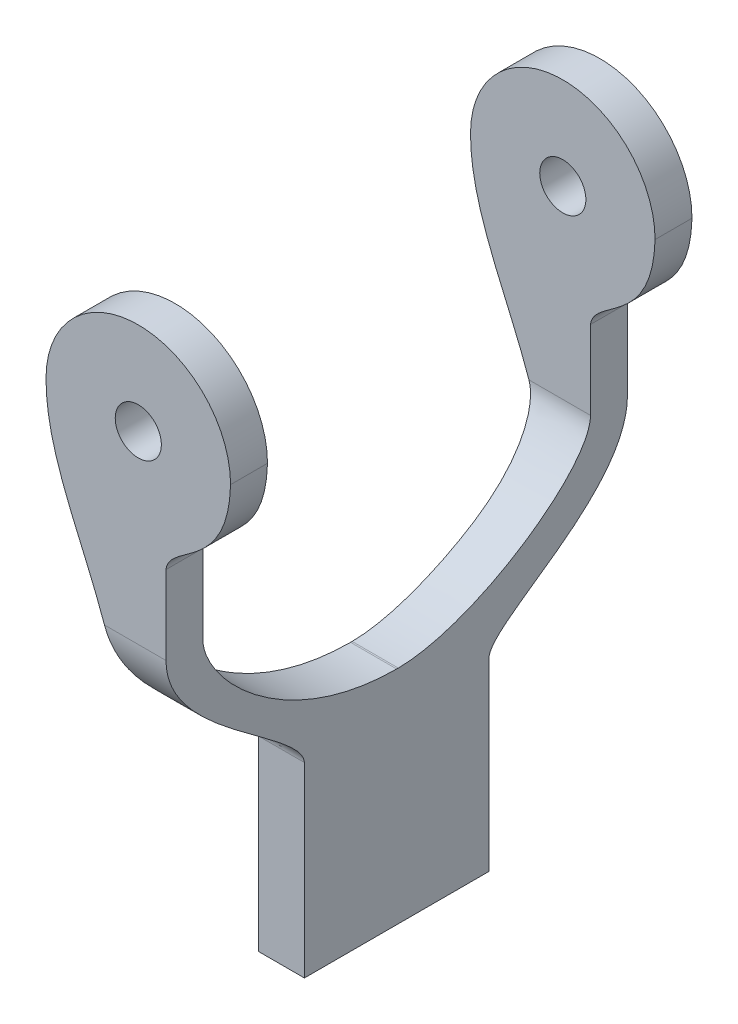
ISO-10303-21;
HEADER;
FILE_DESCRIPTION(('STEP AP214'),'2;1');
FILE_NAME('part.step','',(''),(''),'','','');
FILE_SCHEMA(('AUTOMOTIVE_DESIGN { 1 0 10303 214 1 1 1 1 }'));
ENDSEC;
DATA;
#1=APPLICATION_CONTEXT('core data for automotive mechanical design processes');
#2=APPLICATION_PROTOCOL_DEFINITION('international standard','automotive_design',2000,#1);
#3=PRODUCT_CONTEXT('',#1,'mechanical');
#4=PRODUCT('Part','Part','',(#3));
#5=PRODUCT_RELATED_PRODUCT_CATEGORY('part','',(#4));
#6=PRODUCT_DEFINITION_FORMATION('','',#4);
#7=PRODUCT_DEFINITION_CONTEXT('part definition',#1,'design');
#8=PRODUCT_DEFINITION('design','',#6,#7);
#9=PRODUCT_DEFINITION_SHAPE('','',#8);
#10=(LENGTH_UNIT() NAMED_UNIT(*) SI_UNIT(.MILLI.,.METRE.));
#11=(NAMED_UNIT(*) PLANE_ANGLE_UNIT() SI_UNIT($,.RADIAN.));
#12=(NAMED_UNIT(*) SI_UNIT($,.STERADIAN.) SOLID_ANGLE_UNIT());
#13=UNCERTAINTY_MEASURE_WITH_UNIT(LENGTH_MEASURE(1.E-05),#10,'distance_accuracy_value','');
#14=(GEOMETRIC_REPRESENTATION_CONTEXT(3) GLOBAL_UNCERTAINTY_ASSIGNED_CONTEXT((#13)) GLOBAL_UNIT_ASSIGNED_CONTEXT((#10,
#11,#12)) REPRESENTATION_CONTEXT('',''));
#15=CARTESIAN_POINT('',(0.,0.,0.));
#16=DIRECTION('',(0.,0.,1.));
#17=DIRECTION('',(1.,0.,0.));
#18=AXIS2_PLACEMENT_3D('',#15,#16,#17);
#19=CARTESIAN_POINT('',(3.,0.,25.));
#20=DIRECTION('',(1.,0.,0.));
#21=DIRECTION('',(0.,0.,-1.));
#22=AXIS2_PLACEMENT_3D('',#19,#20,#21);
#23=PLANE('',#22);
#24=DIRECTION('',(0.,1.,0.));
#25=VECTOR('',#24,1.);
#26=CARTESIAN_POINT('',(3.,0.,-10.));
#27=LINE('',#26,#25);
#28=CARTESIAN_POINT('',(3.,-57.3,-10.));
#29=VERTEX_POINT('',#28);
#30=CARTESIAN_POINT('',(3.,-37.3,-10.));
#31=VERTEX_POINT('',#30);
#32=EDGE_CURVE('E347',#29,#31,#27,.T.);
#33=ORIENTED_EDGE('',*,*,#32,.T.);
#34=CARTESIAN_POINT('',(3.,-37.3,-9.99999999999999));
#35=CARTESIAN_POINT('',(3.,-34.0652013670459,-10.0479767693539));
#36=CARTESIAN_POINT('',(3.,-28.7930723376255,-25.1781601039604));
#37=CARTESIAN_POINT('',(3.,-20.0028165207012,-25.));
#38=B_SPLINE_CURVE_WITH_KNOTS('',3,(#34,#35,#36,#37),.UNSPECIFIED.,.F.,.F.,(4,4),(0.,1.),.UNSPECIFIED.);
#39=CARTESIAN_POINT('',(3.,-20.3106734036544,-25.));
#40=VERTEX_POINT('',#39);
#41=EDGE_CURVE('E459',#31,#40,#38,.T.);
#42=ORIENTED_EDGE('',*,*,#41,.T.);
#43=DIRECTION('',(0.,-1.,0.));
#44=VECTOR('',#43,1.);
#45=CARTESIAN_POINT('',(3.,0.,-25.));
#46=LINE('',#45,#44);
#47=CARTESIAN_POINT('',(3.,-11.4728165207012,-25.));
#48=VERTEX_POINT('',#47);
#49=EDGE_CURVE('E493',#48,#40,#46,.T.);
#50=ORIENTED_EDGE('',*,*,#49,.F.);
#51=DIRECTION('',(0.,0.,-1.));
#52=VECTOR('',#51,1.);
#53=CARTESIAN_POINT('',(3.,-11.4728165207012,25.));
#54=LINE('',#53,#52);
#55=CARTESIAN_POINT('',(3.,-11.4728165207012,-21.));
#56=VERTEX_POINT('',#55);
#57=EDGE_CURVE('E385',#56,#48,#54,.T.);
#58=ORIENTED_EDGE('',*,*,#57,.F.);
#59=DIRECTION('',(0.,1.,0.));
#60=VECTOR('',#59,1.);
#61=CARTESIAN_POINT('',(3.,0.,-21.));
#62=LINE('',#61,#60);
#63=CARTESIAN_POINT('',(3.,-20.0028165207012,-21.));
#64=VERTEX_POINT('',#63);
#65=EDGE_CURVE('E402',#64,#56,#62,.T.);
#66=ORIENTED_EDGE('',*,*,#65,.F.);
#67=CARTESIAN_POINT('',(3.,-33.3,0.));
#68=CARTESIAN_POINT('',(3.,-33.359111525618,-8.33744702188347));
#69=CARTESIAN_POINT('',(3.,-24.8668680805232,-20.9939397330463));
#70=CARTESIAN_POINT('',(3.,-20.,-21.));
#71=B_SPLINE_CURVE_WITH_KNOTS('',3,(#67,#68,#69,#70),.UNSPECIFIED.,.F.,.F.,(4,4),(0.,1.),.UNSPECIFIED.);
#72=CARTESIAN_POINT('',(3.,-33.3,-0.174087166710104));
#73=VERTEX_POINT('',#72);
#74=EDGE_CURVE('E497',#73,#64,#71,.T.);
#75=ORIENTED_EDGE('',*,*,#74,.F.);
#76=DIRECTION('',(0.,0.,-1.));
#77=VECTOR('',#76,1.);
#78=CARTESIAN_POINT('',(3.,-33.3,25.));
#79=LINE('',#78,#77);
#80=CARTESIAN_POINT('',(3.,-33.3,0.));
#81=VERTEX_POINT('',#80);
#82=EDGE_CURVE('E418',#81,#73,#79,.T.);
#83=ORIENTED_EDGE('',*,*,#82,.F.);
#84=CARTESIAN_POINT('',(3.,-33.3,0.));
#85=CARTESIAN_POINT('',(3.,-33.2659898949271,12.3142037143707));
#86=CARTESIAN_POINT('',(3.,-24.1587315010529,21.0250877018744));
#87=CARTESIAN_POINT('',(3.,-20.,21.));
#88=B_SPLINE_CURVE_WITH_KNOTS('',3,(#84,#85,#86,#87),.UNSPECIFIED.,.F.,.F.,(4,4),(0.,1.),.UNSPECIFIED.);
#89=CARTESIAN_POINT('',(3.,-20.0359703307455,21.));
#90=VERTEX_POINT('',#89);
#91=EDGE_CURVE('E560',#81,#90,#88,.T.);
#92=ORIENTED_EDGE('',*,*,#91,.T.);
#93=DIRECTION('',(0.,1.,0.));
#94=VECTOR('',#93,1.);
#95=CARTESIAN_POINT('',(3.,0.,21.));
#96=LINE('',#95,#94);
#97=CARTESIAN_POINT('',(3.,-11.4728165207012,21.));
#98=VERTEX_POINT('',#97);
#99=EDGE_CURVE('E602',#90,#98,#96,.T.);
#100=ORIENTED_EDGE('',*,*,#99,.T.);
#101=CARTESIAN_POINT('',(3.,-11.4728165207012,25.));
#102=VERTEX_POINT('',#101);
#103=EDGE_CURVE('E386',#102,#98,#54,.T.);
#104=ORIENTED_EDGE('',*,*,#103,.F.);
#105=DIRECTION('',(0.,-1.,0.));
#106=VECTOR('',#105,1.);
#107=CARTESIAN_POINT('',(3.,0.,25.));
#108=LINE('',#107,#106);
#109=CARTESIAN_POINT('',(3.,-20.0028165207012,25.));
#110=VERTEX_POINT('',#109);
#111=EDGE_CURVE('E517',#102,#110,#108,.T.);
#112=ORIENTED_EDGE('',*,*,#111,.T.);
#113=CARTESIAN_POINT('',(3.,-20.0028165207012,25.));
#114=CARTESIAN_POINT('',(3.,-27.9711739392225,24.9582128322427));
#115=CARTESIAN_POINT('',(3.,-33.8732366485427,9.68018084542401));
#116=CARTESIAN_POINT('',(3.,-37.3,10.));
#117=B_SPLINE_CURVE_WITH_KNOTS('',3,(#113,#114,#115,#116),.UNSPECIFIED.,.F.,.F.,(4,4),(0.,1.),.UNSPECIFIED.);
#118=CARTESIAN_POINT('',(3.,-37.083079187129,10.));
#119=VERTEX_POINT('',#118);
#120=EDGE_CURVE('E238',#110,#119,#117,.T.);
#121=ORIENTED_EDGE('',*,*,#120,.T.);
#122=DIRECTION('',(0.,1.,0.));
#123=VECTOR('',#122,1.);
#124=CARTESIAN_POINT('',(3.,0.,10.));
#125=LINE('',#124,#123);
#126=CARTESIAN_POINT('',(3.,-57.3,10.));
#127=VERTEX_POINT('',#126);
#128=EDGE_CURVE('E363',#127,#119,#125,.T.);
#129=ORIENTED_EDGE('',*,*,#128,.F.);
#130=DIRECTION('',(0.,0.,-1.));
#131=VECTOR('',#130,1.);
#132=CARTESIAN_POINT('',(3.,-57.3,25.));
#133=LINE('',#132,#131);
#134=EDGE_CURVE('E369',#127,#29,#133,.T.);
#135=ORIENTED_EDGE('',*,*,#134,.T.);
#136=EDGE_LOOP('',(#33,#42,#50,#58,#66,#75,#83,#92,#100,#104,#112,#121,#129,#135));
#137=FACE_BOUND('',#136,.T.);
#138=ADVANCED_FACE('F214',(#137),#23,.T.);
#139=CARTESIAN_POINT('',(10.,0.,25.));
#140=CARTESIAN_POINT('',(9.76053706222571,-8.68136411070865,25.));
#141=CARTESIAN_POINT('',(3.33669046636107,-8.62356863497837,25.));
#142=CARTESIAN_POINT('',(3.,-11.4728165207012,25.));
#143=B_SPLINE_CURVE_WITH_KNOTS('',3,(#139,#140,#141,#142),.UNSPECIFIED.,.F.,.F.,(4,4),(0.,1.),.UNSPECIFIED.);
#144=DIRECTION('',(0.,0.,-1.));
#145=VECTOR('',#144,1.);
#146=SURFACE_OF_LINEAR_EXTRUSION('',#143,#145);
#147=ORIENTED_EDGE('',*,*,#103,.T.);
#148=CARTESIAN_POINT('',(10.,0.,21.));
#149=CARTESIAN_POINT('',(9.76053706222571,-8.68136411070865,21.));
#150=CARTESIAN_POINT('',(3.33669046636107,-8.62356863497837,21.));
#151=CARTESIAN_POINT('',(3.,-11.4728165207012,21.));
#152=B_SPLINE_CURVE_WITH_KNOTS('',3,(#148,#149,#150,#151),.UNSPECIFIED.,.F.,.F.,(4,4),(0.,1.),.UNSPECIFIED.);
#153=CARTESIAN_POINT('',(10.,0.,21.));
#154=VERTEX_POINT('',#153);
#155=EDGE_CURVE('E614',#98,#154,#152,.F.);
#156=ORIENTED_EDGE('',*,*,#155,.T.);
#157=DIRECTION('',(0.,0.,-1.));
#158=VECTOR('',#157,1.);
#159=CARTESIAN_POINT('',(10.,0.,25.));
#160=LINE('',#159,#158);
#161=CARTESIAN_POINT('',(10.,0.,25.));
#162=VERTEX_POINT('',#161);
#163=EDGE_CURVE('E382',#162,#154,#160,.T.);
#164=ORIENTED_EDGE('',*,*,#163,.F.);
#165=EDGE_CURVE('E521',#162,#102,#143,.T.);
#166=ORIENTED_EDGE('',*,*,#165,.T.);
#167=EDGE_LOOP('',(#147,#156,#164,#166));
#168=FACE_BOUND('',#167,.T.);
#169=ADVANCED_FACE('F540',(#168),#146,.T.);
#170=CARTESIAN_POINT('',(0.,0.,25.));
#171=DIRECTION('',(0.,0.,-1.));
#172=DIRECTION('',(-1.,0.,0.));
#173=AXIS2_PLACEMENT_3D('',#170,#171,#172);
#174=CYLINDRICAL_SURFACE('',#173,10.);
#175=CARTESIAN_POINT('',(0.,0.,21.));
#176=DIRECTION('',(0.,0.,-1.));
#177=DIRECTION('',(-1.,0.,0.));
#178=AXIS2_PLACEMENT_3D('',#175,#176,#177);
#179=CIRCLE('',#178,10.);
#180=CARTESIAN_POINT('',(-10.,0.,21.));
#181=VERTEX_POINT('',#180);
#182=EDGE_CURVE('E612',#181,#154,#179,.T.);
#183=ORIENTED_EDGE('',*,*,#182,.F.);
#184=DIRECTION('',(0.,0.,-1.));
#185=VECTOR('',#184,1.);
#186=CARTESIAN_POINT('',(-10.,0.,25.));
#187=LINE('',#186,#185);
#188=CARTESIAN_POINT('',(-10.,0.,25.));
#189=VERTEX_POINT('',#188);
#190=EDGE_CURVE('E377',#189,#181,#187,.T.);
#191=ORIENTED_EDGE('',*,*,#190,.F.);
#192=CARTESIAN_POINT('',(0.,0.,25.));
#193=DIRECTION('',(0.,0.,1.));
#194=DIRECTION('',(1.,0.,0.));
#195=AXIS2_PLACEMENT_3D('',#192,#193,#194);
#196=CIRCLE('',#195,10.);
#197=EDGE_CURVE('E486',#162,#189,#196,.T.);
#198=ORIENTED_EDGE('',*,*,#197,.F.);
#199=ORIENTED_EDGE('',*,*,#163,.T.);
#200=EDGE_LOOP('',(#183,#191,#198,#199));
#201=FACE_BOUND('',#200,.T.);
#202=ADVANCED_FACE('F473',(#201),#174,.T.);
#203=CARTESIAN_POINT('',(-10.,0.,25.));
#204=CARTESIAN_POINT('',(-10.0381025429552,-9.9152488273029,25.));
#205=CARTESIAN_POINT('',(-2.13214803939277,-18.0107089346552,25.));
#206=CARTESIAN_POINT('',(-2.,-28.65,25.));
#207=B_SPLINE_CURVE_WITH_KNOTS('',3,(#203,#204,#205,#206),.UNSPECIFIED.,.F.,.F.,(4,4),(0.,1.),.UNSPECIFIED.);
#208=DIRECTION('',(0.,0.,-1.));
#209=VECTOR('',#208,1.);
#210=SURFACE_OF_LINEAR_EXTRUSION('',#207,#209);
#211=CARTESIAN_POINT('',(-2.,-28.65,-20.1616995889668));
#212=CARTESIAN_POINT('',(-2.00182111907394,-28.5037563772245,-20.3261490306534));
#213=CARTESIAN_POINT('',(-2.00513084592859,-28.3556614860863,-20.4889648065963));
#214=CARTESIAN_POINT('',(-2.01497313735473,-28.0551972471893,-20.8109792409285));
#215=CARTESIAN_POINT('',(-2.02151077106654,-27.9028215328921,-20.9701717966971));
#216=CARTESIAN_POINT('',(-2.03805462027084,-27.5936010660985,-21.2841506119689));
#217=CARTESIAN_POINT('',(-2.04806265898774,-27.4367540043506,-21.4389345089768));
#218=CARTESIAN_POINT('',(-2.07204383454484,-27.1153090941464,-21.7461792362221));
#219=CARTESIAN_POINT('',(-2.0860887804213,-26.9506205601231,-21.8985398563874));
#220=CARTESIAN_POINT('',(-2.11836318547303,-26.6160845354663,-22.1968992956912));
#221=CARTESIAN_POINT('',(-2.13659081584744,-26.4462393275714,-22.3429008621101));
#222=CARTESIAN_POINT('',(-2.17755452196144,-26.1010766292466,-22.6275661068287));
#223=CARTESIAN_POINT('',(-2.20028975066627,-25.925760172141,-22.76623115756));
#224=CARTESIAN_POINT('',(-2.25763101491563,-25.5196239028146,-23.0726603173966));
#225=CARTESIAN_POINT('',(-2.29377908239088,-25.286975282638,-23.2377380399204));
#226=CARTESIAN_POINT('',(-2.37466566201301,-24.8120868765789,-23.5513085498817));
#227=CARTESIAN_POINT('',(-2.41940500717265,-24.5698461624536,-23.6997997268729));
#228=CARTESIAN_POINT('',(-2.51753258410257,-24.0784037222004,-23.9757765156666));
#229=CARTESIAN_POINT('',(-2.57083451240261,-23.8292901112768,-24.1034484729474));
#230=CARTESIAN_POINT('',(-2.68664221369204,-23.3228334094045,-24.3363140694226));
#231=CARTESIAN_POINT('',(-2.74914484549644,-23.0654931504723,-24.441515350338));
#232=CARTESIAN_POINT('',(-2.86794637984654,-22.6035430889516,-24.6054686407789));
#233=CARTESIAN_POINT('',(-2.9224158201651,-22.4002731827862,-24.6693426519717));
#234=CARTESIAN_POINT('',(-3.03650367448392,-21.9907703281117,-24.7808701918356));
#235=CARTESIAN_POINT('',(-3.09612118947195,-21.7845379021725,-24.8285265454556));
#236=CARTESIAN_POINT('',(-3.22097910854256,-21.3672829061071,-24.907414423582));
#237=CARTESIAN_POINT('',(-3.28628769455284,-21.1562339997317,-24.9384014830389));
#238=CARTESIAN_POINT('',(-3.38743679651639,-20.8392692830144,-24.9715158955908));
#239=CARTESIAN_POINT('',(-3.42169852884616,-20.7335068125072,-24.9803271831089));
#240=CARTESIAN_POINT('',(-3.49119232003825,-20.5220231575566,-24.9934984957739));
#241=CARTESIAN_POINT('',(-3.52642437987454,-20.4163019731547,-24.9978585164527));
#242=CARTESIAN_POINT('',(-3.56209934709974,-20.3106734036559,-24.9999999999999));
#243=B_SPLINE_CURVE_WITH_KNOTS('',3,(#211,#212,#213,#214,#215,#216,#217,#218,#219,#220,#221,
#222,#223,#224,#225,#226,#227,#228,#229,#230,#231,#232,#233,#234,#235,#236,#237,#238,#239,#240,
#241,#242),.UNSPECIFIED.,.F.,.F.,(4,2,2,2,2,2,2,2,2,2,2,2,2,2,2,4),(0.,0.660246256760581,
1.32153268523511,1.98316705719335,2.65738818509258,3.33131508217323,4.00511545968604,
4.86706232690551,5.7290928109784,6.58292481096038,7.43646597986526,8.09559987909252,
8.75461890514396,9.42305615112078,9.75754218811007,10.0920285608561),.UNSPECIFIED.);
#244=CARTESIAN_POINT('',(-2.,-28.6499999902508,-20.1616995999306));
#245=VERTEX_POINT('',#244);
#246=CARTESIAN_POINT('',(-3.56209934741176,-20.310673402732,-25.));
#247=VERTEX_POINT('',#246);
#248=EDGE_CURVE('E452',#245,#247,#243,.T.);
#249=ORIENTED_EDGE('',*,*,#248,.F.);
#250=DIRECTION('',(0.,0.,-1.));
#251=VECTOR('',#250,1.);
#252=CARTESIAN_POINT('',(-2.,-28.65,25.));
#253=LINE('',#252,#251);
#254=CARTESIAN_POINT('',(-2.,-28.6500000000527,-13.3862391043112));
#255=VERTEX_POINT('',#254);
#256=EDGE_CURVE('E368',#255,#245,#253,.T.);
#257=ORIENTED_EDGE('',*,*,#256,.F.);
#258=CARTESIAN_POINT('',(-2.,-28.65,-13.386239104394));
#259=CARTESIAN_POINT('',(-2.00207121104266,-28.4834873633751,-13.6479787262422));
#260=CARTESIAN_POINT('',(-2.00609091873069,-28.3135426154804,-13.907541901666));
#261=CARTESIAN_POINT('',(-2.01849981341696,-27.9663615837655,-14.4222262435648));
#262=CARTESIAN_POINT('',(-2.0268958240593,-27.7891143122877,-14.6773398282906));
#263=CARTESIAN_POINT('',(-2.04853250189037,-27.4273160625165,-15.1823602348332));
#264=CARTESIAN_POINT('',(-2.06177597063975,-27.242760915797,-15.4322639571845));
#265=CARTESIAN_POINT('',(-2.09351428157803,-26.8672247473136,-15.9246453424175));
#266=CARTESIAN_POINT('',(-2.11197920424671,-26.676285649953,-16.1671568368731));
#267=CARTESIAN_POINT('',(-2.15470265613409,-26.2867235042077,-16.6452273856041));
#268=CARTESIAN_POINT('',(-2.17895844302684,-26.0881041300987,-16.8807896716035));
#269=CARTESIAN_POINT('',(-2.23382902633832,-25.6826597228866,-17.3438472305904));
#270=CARTESIAN_POINT('',(-2.26444121772705,-25.4758380793037,-17.5713457637511));
#271=CARTESIAN_POINT('',(-2.32388573334487,-25.1076337013097,-17.9594558747418));
#272=CARTESIAN_POINT('',(-2.35114817203311,-24.9482571239773,-18.122211941066));
#273=CARTESIAN_POINT('',(-2.40983064833719,-24.6241923854366,-18.4416116100705));
#274=CARTESIAN_POINT('',(-2.44125088550903,-24.4595039695705,-18.5982549188978));
#275=CARTESIAN_POINT('',(-2.50882069282215,-24.1231660718983,-18.9054282361442));
#276=CARTESIAN_POINT('',(-2.54500330151712,-23.9514743493605,-19.0559048981357));
#277=CARTESIAN_POINT('',(-2.62229066396851,-23.6017557790175,-19.34799200798));
#278=CARTESIAN_POINT('',(-2.6633947495609,-23.4237297934845,-19.4896036554245));
#279=CARTESIAN_POINT('',(-2.73687408214795,-23.1190724041527,-19.7180983018779));
#280=CARTESIAN_POINT('',(-2.76780862215161,-22.9943131710881,-19.8079425094573));
#281=CARTESIAN_POINT('',(-2.83229162687615,-22.741345086224,-19.9817259552737));
#282=CARTESIAN_POINT('',(-2.86584058769767,-22.6131355827533,-20.0656640670184));
#283=CARTESIAN_POINT('',(-2.93573224193051,-22.3529450458945,-20.2265890800579));
#284=CARTESIAN_POINT('',(-2.97207783075551,-22.2209601950598,-20.3035685927039));
#285=CARTESIAN_POINT('',(-3.04717913654365,-21.9549288778975,-20.4480707976687));
#286=CARTESIAN_POINT('',(-3.08589663521493,-21.8209327400507,-20.5157050651148));
#287=CARTESIAN_POINT('',(-3.16624148575989,-21.5492441932871,-20.6408323650763));
#288=CARTESIAN_POINT('',(-3.20786628829075,-21.4115550863252,-20.6983341304364));
#289=CARTESIAN_POINT('',(-3.29403583721203,-21.1326914427783,-20.8008281106864));
#290=CARTESIAN_POINT('',(-3.33857477611942,-20.991524168046,-20.8458443223945));
#291=CARTESIAN_POINT('',(-3.40677618897257,-20.7797368969403,-20.9012119047565));
#292=CARTESIAN_POINT('',(-3.42935579575568,-20.7102902473308,-20.9174662057377));
#293=CARTESIAN_POINT('',(-3.47514170397102,-20.5707969190174,-20.9459609668642));
#294=CARTESIAN_POINT('',(-3.49834778378203,-20.5007504583384,-20.958202826823));
#295=CARTESIAN_POINT('',(-3.56927787118845,-20.2885859676642,-20.9884624129899));
#296=CARTESIAN_POINT('',(-3.61788170937749,-20.1457842609385,-20.999647838311));
#297=CARTESIAN_POINT('',(-3.66739390522126,-20.0028165091733,-20.999995081653));
#298=B_SPLINE_CURVE_WITH_KNOTS('',3,(#258,#259,#260,#261,#262,#263,#264,#265,#266,#267,#268,
#269,#270,#271,#272,#273,#274,#275,#276,#277,#278,#279,#280,#281,#282,#283,#284,#285,#286,#287,
#288,#289,#290,#291,#292,#293,#294,#295,#296,#297),.UNSPECIFIED.,.F.,.F.,(4,2,2,2,2,2,2,2,2,2,2,
2,2,2,2,2,2,2,2,4),(0.,0.930664533808703,1.8627845438686,2.79544412016203,3.72286413328104,
4.64984582482677,5.57644836086889,6.26455533861794,6.95269535445792,7.6458892256858,
8.33898909197358,8.80931931524198,9.27973900457951,9.7506524587737,10.2153398312038,
10.6796247260602,11.1430109977267,11.367357141486,11.5916249344654,12.0444969054281),.UNSPECIFIED.);
#299=CARTESIAN_POINT('',(-3.66739390522125,-20.0028165207012,-21.));
#300=VERTEX_POINT('',#299);
#301=EDGE_CURVE('E595',#255,#300,#298,.T.);
#302=ORIENTED_EDGE('',*,*,#301,.T.);
#303=CARTESIAN_POINT('',(-10.,0.,-21.));
#304=CARTESIAN_POINT('',(-10.0381025429552,-9.9152488273029,-21.));
#305=CARTESIAN_POINT('',(-2.13214803939277,-18.0107089346552,-21.));
#306=CARTESIAN_POINT('',(-2.,-28.65,-21.));
#307=B_SPLINE_CURVE_WITH_KNOTS('',3,(#303,#304,#305,#306),.UNSPECIFIED.,.F.,.F.,(4,4),(0.,1.),.UNSPECIFIED.);
#308=CARTESIAN_POINT('',(-10.,0.,-21.));
#309=VERTEX_POINT('',#308);
#310=EDGE_CURVE('E397',#300,#309,#307,.F.);
#311=ORIENTED_EDGE('',*,*,#310,.T.);
#312=CARTESIAN_POINT('',(-10.,0.,-25.));
#313=VERTEX_POINT('',#312);
#314=EDGE_CURVE('E381',#309,#313,#187,.T.);
#315=ORIENTED_EDGE('',*,*,#314,.T.);
#316=CARTESIAN_POINT('',(-10.,0.,-25.));
#317=CARTESIAN_POINT('',(-10.0381025429552,-9.9152488273029,-25.));
#318=CARTESIAN_POINT('',(-2.13214803939277,-18.0107089346552,-25.));
#319=CARTESIAN_POINT('',(-2.,-28.65,-25.));
#320=B_SPLINE_CURVE_WITH_KNOTS('',3,(#316,#317,#318,#319),.UNSPECIFIED.,.F.,.F.,(4,4),(0.,1.),.UNSPECIFIED.);
#321=EDGE_CURVE('E508',#313,#247,#320,.T.);
#322=ORIENTED_EDGE('',*,*,#321,.T.);
#323=EDGE_LOOP('',(#249,#257,#302,#311,#315,#322));
#324=FACE_BOUND('',#323,.T.);
#325=ADVANCED_FACE('F466',(#324),#210,.F.);
#326=CARTESIAN_POINT('',(-10.,0.,21.));
#327=CARTESIAN_POINT('',(-10.0381025429552,-9.9152488273029,21.));
#328=CARTESIAN_POINT('',(-2.13214803939277,-18.0107089346552,21.));
#329=CARTESIAN_POINT('',(-2.,-28.65,21.));
#330=B_SPLINE_CURVE_WITH_KNOTS('',3,(#326,#327,#328,#329),.UNSPECIFIED.,.F.,.F.,(4,4),(0.,1.),.UNSPECIFIED.);
#331=CARTESIAN_POINT('',(-3.65592904242022,-20.0359703307455,21.));
#332=VERTEX_POINT('',#331);
#333=EDGE_CURVE('E401',#332,#181,#330,.F.);
#334=ORIENTED_EDGE('',*,*,#333,.F.);
#335=CARTESIAN_POINT('',(-2.,-28.65,14.5061524823329));
#336=CARTESIAN_POINT('',(-2.00205699692352,-28.4844328849566,14.7406384172276));
#337=CARTESIAN_POINT('',(-2.0060535795085,-28.314796223883,14.9722585411237));
#338=CARTESIAN_POINT('',(-2.01846361571946,-27.9671661929759,15.4295712458671));
#339=CARTESIAN_POINT('',(-2.02688377798787,-27.78916050534,15.6552542753419));
#340=CARTESIAN_POINT('',(-2.04868174776831,-27.4249767317008,16.0999047703334));
#341=CARTESIAN_POINT('',(-2.06206232992661,-27.2387941233567,16.3188684029441));
#342=CARTESIAN_POINT('',(-2.09445118275214,-26.85674081902,16.751110930356));
#343=CARTESIAN_POINT('',(-2.11350657676059,-26.6608009186559,16.964325240477));
#344=CARTESIAN_POINT('',(-2.15773467289778,-26.2608040079047,17.3821651684043));
#345=CARTESIAN_POINT('',(-2.18290451348048,-26.0567508317622,17.5867947514608));
#346=CARTESIAN_POINT('',(-2.23989262638346,-25.6404750883605,17.9864517873914));
#347=CARTESIAN_POINT('',(-2.27170815955318,-25.428255916182,18.1814831555604));
#348=CARTESIAN_POINT('',(-2.34103494159072,-25.0045696943597,18.5527372371088));
#349=CARTESIAN_POINT('',(-2.37825054032862,-24.7934460377416,18.7294059675185));
#350=CARTESIAN_POINT('',(-2.45974324699811,-24.363351064936,19.0713207446693));
#351=CARTESIAN_POINT('',(-2.50402156717549,-24.1443784065568,19.2365648234907));
#352=CARTESIAN_POINT('',(-2.60008246505831,-23.6984363102348,19.5535432520182));
#353=CARTESIAN_POINT('',(-2.6518643902924,-23.4714675688839,19.7052787745024));
#354=CARTESIAN_POINT('',(-2.76336394415543,-23.0093105875226,19.9923794069641));
#355=CARTESIAN_POINT('',(-2.82307737238002,-22.7741267463602,20.1277531099347));
#356=CARTESIAN_POINT('',(-2.9251278360955,-22.3916293520002,20.3275461286502));
#357=CARTESIAN_POINT('',(-2.9647840763476,-22.2470520522818,20.398592152811));
#358=CARTESIAN_POINT('',(-3.04714509970462,-21.9548174992838,20.5320165387259));
#359=CARTESIAN_POINT('',(-3.08984894704338,-21.8071612011815,20.5943975438834));
#360=CARTESIAN_POINT('',(-3.17811506460843,-21.5095787733077,20.7084711878712));
#361=CARTESIAN_POINT('',(-3.22366022902059,-21.3596697027473,20.7602210041261));
#362=CARTESIAN_POINT('',(-3.31777335473246,-21.0570545120406,20.8510860911158));
#363=CARTESIAN_POINT('',(-3.36633884117359,-20.9043507524348,20.8902115477376));
#364=CARTESIAN_POINT('',(-3.45463913577434,-20.6326370229056,20.945235559397));
#365=CARTESIAN_POINT('',(-3.49377659501518,-20.5141163197896,20.9644284333413));
#366=CARTESIAN_POINT('',(-3.55368126040612,-20.3354738959103,20.9846933006479));
#367=CARTESIAN_POINT('',(-3.57389661742184,-20.2756456941128,20.9900298718215));
#368=CARTESIAN_POINT('',(-3.61466991568065,-20.1558638085327,20.9975015621419));
#369=CARTESIAN_POINT('',(-3.63522807888234,-20.0959100673198,20.9996345186417));
#370=CARTESIAN_POINT('',(-3.65592904242023,-20.0359703416025,21.0000000049778));
#371=B_SPLINE_CURVE_WITH_KNOTS('',3,(#335,#336,#337,#338,#339,#340,#341,#342,#343,#344,#345,
#346,#347,#348,#349,#350,#351,#352,#353,#354,#355,#356,#357,#358,#359,#360,#361,#362,#363,#364,
#365,#366,#367,#368,#369,#370),.UNSPECIFIED.,.F.,.F.,(4,2,2,2,2,2,2,2,2,2,2,2,2,2,2,2,2,4),(0.,
0.861144145580523,1.72359805766815,2.58653511919959,3.4568478564734,4.32675407153834,
5.19630244295841,6.02929783778224,6.86243636212501,7.69550248484448,8.52812917434111,
9.02560070692728,9.52292014293737,10.0174904755348,10.5116607634292,10.8900362344036,
11.0800911383476,11.270274284062),.UNSPECIFIED.);
#372=CARTESIAN_POINT('',(-2.,-28.6499999902718,14.5061524961117));
#373=VERTEX_POINT('',#372);
#374=EDGE_CURVE('E558',#373,#332,#371,.T.);
#375=ORIENTED_EDGE('',*,*,#374,.F.);
#376=CARTESIAN_POINT('',(-2.,-28.6500000000026,19.4889030479592));
#377=VERTEX_POINT('',#376);
#378=EDGE_CURVE('E371',#377,#373,#253,.T.);
#379=ORIENTED_EDGE('',*,*,#378,.F.);
#380=CARTESIAN_POINT('',(-3.66739390122903,-20.0028165207021,25.));
#381=CARTESIAN_POINT('',(-3.63127800692661,-20.107115269633,24.9994611919678));
#382=CARTESIAN_POINT('',(-3.59556533185771,-20.2115371425306,24.9962934215998));
#383=CARTESIAN_POINT('',(-3.52505940805808,-20.4203941828733,24.9847559898187));
#384=CARTESIAN_POINT('',(-3.49026608049867,-20.5248293484022,24.9763867759179));
#385=CARTESIAN_POINT('',(-3.42175415669374,-20.7333502201195,24.9545178818715));
#386=CARTESIAN_POINT('',(-3.38803410759998,-20.8374362117877,24.9410254874248));
#387=CARTESIAN_POINT('',(-3.32171351223734,-21.0451849799858,24.9090258604795));
#388=CARTESIAN_POINT('',(-3.28911298029467,-21.1488477510849,24.8905185638332));
#389=CARTESIAN_POINT('',(-3.19434030406879,-21.4549454398236,24.8284846605544));
#390=CARTESIAN_POINT('',(-3.13386581179896,-21.656539239656,24.7780091478259));
#391=CARTESIAN_POINT('',(-3.01797206570062,-22.0560747062689,24.6597583123318));
#392=CARTESIAN_POINT('',(-2.96255473510786,-22.254014960968,24.5919764448795));
#393=CARTESIAN_POINT('',(-2.84198863006489,-22.7009113442186,24.4193933153508));
#394=CARTESIAN_POINT('',(-2.77854845792781,-22.9483835903842,24.3095457369168));
#395=CARTESIAN_POINT('',(-2.66035722138025,-23.4346194017426,24.0681308020614));
#396=CARTESIAN_POINT('',(-2.60560916824121,-23.6733799269064,23.9365559505745));
#397=CARTESIAN_POINT('',(-2.50377197675663,-24.1449634312931,23.6535120582854));
#398=CARTESIAN_POINT('',(-2.45679573314484,-24.3776633875589,23.5017992817761));
#399=CARTESIAN_POINT('',(-2.37085228643257,-24.8338946290325,23.1832606832826));
#400=CARTESIAN_POINT('',(-2.33188410771937,-25.0574270284533,23.0164367058496));
#401=CARTESIAN_POINT('',(-2.26284269457871,-25.4864118368635,22.6779332617616));
#402=CARTESIAN_POINT('',(-2.23245791971705,-25.6922281357065,22.5067748956326));
#403=CARTESIAN_POINT('',(-2.17787855347233,-26.0966724191461,22.1551046725237));
#404=CARTESIAN_POINT('',(-2.15368651531321,-26.2952974099314,21.974588994352));
#405=CARTESIAN_POINT('',(-2.11098657748873,-26.6860618216691,21.6057926814962));
#406=CARTESIAN_POINT('',(-2.0924825720272,-26.8781967195504,21.4175068266982));
#407=CARTESIAN_POINT('',(-2.06119124921957,-27.2509644137372,21.0402431864902));
#408=CARTESIAN_POINT('',(-2.04825232969332,-27.4317692751376,20.851447287625));
#409=CARTESIAN_POINT('',(-2.02696364914079,-27.7882141440719,20.4691032842627));
#410=CARTESIAN_POINT('',(-2.01861007137091,-27.9638583316146,20.2755592726319));
#411=CARTESIAN_POINT('',(-2.00618630620653,-28.3103042774104,19.884845203534));
#412=CARTESIAN_POINT('',(-2.00210623859205,-28.4811163130558,19.6876845871341));
#413=CARTESIAN_POINT('',(-2.,-28.65,19.4889030479622));
#414=B_SPLINE_CURVE_WITH_KNOTS('',3,(#380,#381,#382,#383,#384,#385,#386,#387,#388,#389,#390,
#391,#392,#393,#394,#395,#396,#397,#398,#399,#400,#401,#402,#403,#404,#405,#406,#407,#408,#409,
#410,#411,#412,#413),.UNSPECIFIED.,.F.,.F.,(4,2,2,2,2,2,2,2,2,2,2,2,2,2,2,2,4),(0.,
0.331091774908501,0.662155067896405,0.992749306905636,1.32334777488184,1.97173823388237,
2.62037425666292,3.45330020614536,4.28651408527807,5.13093270831873,5.97524839580926,
6.78308921567519,7.59126256840276,8.39998799568733,9.18501973686678,9.96939703911823,
10.7519568558985),.UNSPECIFIED.);
#415=CARTESIAN_POINT('',(-3.66739390156207,-20.0028165207012,25.));
#416=VERTEX_POINT('',#415);
#417=EDGE_CURVE('E637',#416,#377,#414,.T.);
#418=ORIENTED_EDGE('',*,*,#417,.F.);
#419=EDGE_CURVE('E479',#189,#416,#207,.T.);
#420=ORIENTED_EDGE('',*,*,#419,.F.);
#421=ORIENTED_EDGE('',*,*,#190,.T.);
#422=EDGE_LOOP('',(#334,#375,#379,#418,#420,#421));
#423=FACE_BOUND('',#422,.T.);
#424=ADVANCED_FACE('F472',(#423),#210,.F.);
#425=CARTESIAN_POINT('',(-2.,0.,25.));
#426=DIRECTION('',(1.,0.,0.));
#427=DIRECTION('',(0.,0.,-1.));
#428=AXIS2_PLACEMENT_3D('',#425,#426,#427);
#429=PLANE('',#428);
#430=CARTESIAN_POINT('',(-2.,-37.3,-9.99999999999999));
#431=CARTESIAN_POINT('',(-2.,-34.0652013670459,-10.0479767693539));
#432=CARTESIAN_POINT('',(-2.,-28.7930723376255,-25.1781601039604));
#433=CARTESIAN_POINT('',(-2.,-20.0028165207012,-25.));
#434=B_SPLINE_CURVE_WITH_KNOTS('',3,(#430,#431,#432,#433),.UNSPECIFIED.,.F.,.F.,(4,4),(0.,1.),.UNSPECIFIED.);
#435=CARTESIAN_POINT('',(-2.,-37.3,-10.));
#436=VERTEX_POINT('',#435);
#437=EDGE_CURVE('E362',#436,#245,#434,.T.);
#438=ORIENTED_EDGE('',*,*,#437,.F.);
#439=DIRECTION('',(0.,1.,0.));
#440=VECTOR('',#439,1.);
#441=CARTESIAN_POINT('',(-2.,0.,-10.));
#442=LINE('',#441,#440);
#443=CARTESIAN_POINT('',(-2.,-57.3,-10.));
#444=VERTEX_POINT('',#443);
#445=EDGE_CURVE('E344',#444,#436,#442,.T.);
#446=ORIENTED_EDGE('',*,*,#445,.F.);
#447=DIRECTION('',(0.,0.,-1.));
#448=VECTOR('',#447,1.);
#449=CARTESIAN_POINT('',(-2.,-57.3,25.));
#450=LINE('',#449,#448);
#451=CARTESIAN_POINT('',(-2.,-57.3,10.));
#452=VERTEX_POINT('',#451);
#453=EDGE_CURVE('E360',#452,#444,#450,.T.);
#454=ORIENTED_EDGE('',*,*,#453,.F.);
#455=DIRECTION('',(0.,1.,0.));
#456=VECTOR('',#455,1.);
#457=CARTESIAN_POINT('',(-2.,0.,10.));
#458=LINE('',#457,#456);
#459=CARTESIAN_POINT('',(-2.,-37.083079187129,10.));
#460=VERTEX_POINT('',#459);
#461=EDGE_CURVE('E632',#452,#460,#458,.T.);
#462=ORIENTED_EDGE('',*,*,#461,.T.);
#463=CARTESIAN_POINT('',(-2.,-20.0028165207012,25.));
#464=CARTESIAN_POINT('',(-2.,-27.9711739392225,24.9582128322427));
#465=CARTESIAN_POINT('',(-2.,-33.8732366485427,9.68018084542401));
#466=CARTESIAN_POINT('',(-2.,-37.3,10.));
#467=B_SPLINE_CURVE_WITH_KNOTS('',3,(#463,#464,#465,#466),.UNSPECIFIED.,.F.,.F.,(4,4),(0.,1.),.UNSPECIFIED.);
#468=EDGE_CURVE('E636',#377,#460,#467,.T.);
#469=ORIENTED_EDGE('',*,*,#468,.F.);
#470=ORIENTED_EDGE('',*,*,#378,.T.);
#471=CARTESIAN_POINT('',(-2.,-33.3,0.));
#472=CARTESIAN_POINT('',(-2.,-33.2659898949271,12.3142037143707));
#473=CARTESIAN_POINT('',(-2.,-24.1587315010529,21.0250877018744));
#474=CARTESIAN_POINT('',(-2.,-20.,21.));
#475=B_SPLINE_CURVE_WITH_KNOTS('',3,(#471,#472,#473,#474),.UNSPECIFIED.,.F.,.F.,(4,4),(0.,1.),.UNSPECIFIED.);
#476=CARTESIAN_POINT('',(-2.,-33.3,0.));
#477=VERTEX_POINT('',#476);
#478=EDGE_CURVE('E393',#477,#373,#475,.T.);
#479=ORIENTED_EDGE('',*,*,#478,.F.);
#480=DIRECTION('',(0.,0.,-1.));
#481=VECTOR('',#480,1.);
#482=CARTESIAN_POINT('',(-2.,-33.3,25.));
#483=LINE('',#482,#481);
#484=CARTESIAN_POINT('',(-2.,-33.3,-0.174087166710104));
#485=VERTEX_POINT('',#484);
#486=EDGE_CURVE('E223',#477,#485,#483,.T.);
#487=ORIENTED_EDGE('',*,*,#486,.T.);
#488=CARTESIAN_POINT('',(-2.,-33.3,0.));
#489=CARTESIAN_POINT('',(-2.,-33.359111525618,-8.33744702188347));
#490=CARTESIAN_POINT('',(-2.,-24.8668680805232,-20.9939397330463));
#491=CARTESIAN_POINT('',(-2.,-20.,-21.));
#492=B_SPLINE_CURVE_WITH_KNOTS('',3,(#488,#489,#490,#491),.UNSPECIFIED.,.F.,.F.,(4,4),(0.,1.),.UNSPECIFIED.);
#493=EDGE_CURVE('E12',#485,#255,#492,.T.);
#494=ORIENTED_EDGE('',*,*,#493,.T.);
#495=ORIENTED_EDGE('',*,*,#256,.T.);
#496=EDGE_LOOP('',(#438,#446,#454,#462,#469,#470,#479,#487,#494,#495));
#497=FACE_BOUND('',#496,.T.);
#498=ADVANCED_FACE('F358',(#497),#429,.F.);
#499=CARTESIAN_POINT('',(0.,-57.3,25.));
#500=DIRECTION('',(0.,-1.,0.));
#501=DIRECTION('',(0.,0.,-1.));
#502=AXIS2_PLACEMENT_3D('',#499,#500,#501);
#503=PLANE('',#502);
#504=ORIENTED_EDGE('',*,*,#453,.T.);
#505=DIRECTION('',(1.,0.,0.));
#506=VECTOR('',#505,1.);
#507=CARTESIAN_POINT('',(-10.0190512714776,-57.3,-10.));
#508=LINE('',#507,#506);
#509=EDGE_CURVE('E340',#444,#29,#508,.T.);
#510=ORIENTED_EDGE('',*,*,#509,.T.);
#511=ORIENTED_EDGE('',*,*,#134,.F.);
#512=DIRECTION('',(1.,0.,0.));
#513=VECTOR('',#512,1.);
#514=CARTESIAN_POINT('',(-10.0190512714776,-57.3,10.));
#515=LINE('',#514,#513);
#516=EDGE_CURVE('E367',#452,#127,#515,.T.);
#517=ORIENTED_EDGE('',*,*,#516,.F.);
#518=EDGE_LOOP('',(#504,#510,#511,#517));
#519=FACE_BOUND('',#518,.T.);
#520=ADVANCED_FACE('F366',(#519),#503,.T.);
#521=CARTESIAN_POINT('',(0.,0.,25.));
#522=DIRECTION('',(0.,0.,-1.));
#523=DIRECTION('',(-1.,0.,0.));
#524=AXIS2_PLACEMENT_3D('',#521,#522,#523);
#525=CYLINDRICAL_SURFACE('',#524,2.5);
#526=CARTESIAN_POINT('',(0.,0.,25.));
#527=DIRECTION('',(0.,0.,1.));
#528=DIRECTION('',(1.,0.,0.));
#529=AXIS2_PLACEMENT_3D('',#526,#527,#528);
#530=CIRCLE('',#529,2.5);
#531=CARTESIAN_POINT('',(2.5,0.,25.));
#532=VERTEX_POINT('',#531);
#533=EDGE_CURVE('E373',#532,#532,#530,.T.);
#534=ORIENTED_EDGE('',*,*,#533,.T.);
#535=EDGE_LOOP('',(#534));
#536=FACE_BOUND('',#535,.T.);
#537=CARTESIAN_POINT('',(0.,0.,21.));
#538=DIRECTION('',(0.,0.,-1.));
#539=DIRECTION('',(-1.,0.,0.));
#540=AXIS2_PLACEMENT_3D('',#537,#538,#539);
#541=CIRCLE('',#540,2.5);
#542=CARTESIAN_POINT('',(-2.5,0.,21.));
#543=VERTEX_POINT('',#542);
#544=EDGE_CURVE('E398',#543,#543,#541,.T.);
#545=ORIENTED_EDGE('',*,*,#544,.T.);
#546=EDGE_LOOP('',(#545));
#547=FACE_BOUND('',#546,.T.);
#548=ADVANCED_FACE('F719',(#536,#547),#525,.F.);
#549=CARTESIAN_POINT('',(0.,0.,25.));
#550=DIRECTION('',(0.,0.,1.));
#551=DIRECTION('',(1.,0.,0.));
#552=AXIS2_PLACEMENT_3D('',#549,#550,#551);
#553=PLANE('',#552);
#554=ORIENTED_EDGE('',*,*,#533,.F.);
#555=EDGE_LOOP('',(#554));
#556=FACE_BOUND('',#555,.T.);
#557=ORIENTED_EDGE('',*,*,#419,.T.);
#558=DIRECTION('',(1.,0.,0.));
#559=VECTOR('',#558,1.);
#560=CARTESIAN_POINT('',(-10.0190512714776,-20.0028165207012,25.));
#561=LINE('',#560,#559);
#562=EDGE_CURVE('E391',#416,#110,#561,.T.);
#563=ORIENTED_EDGE('',*,*,#562,.T.);
#564=ORIENTED_EDGE('',*,*,#111,.F.);
#565=ORIENTED_EDGE('',*,*,#165,.F.);
#566=ORIENTED_EDGE('',*,*,#197,.T.);
#567=EDGE_LOOP('',(#557,#563,#564,#565,#566));
#568=FACE_BOUND('',#567,.T.);
#569=ADVANCED_FACE('F547',(#556,#568),#553,.T.);
#570=CARTESIAN_POINT('',(0.,0.,-25.));
#571=DIRECTION('',(0.,0.,1.));
#572=DIRECTION('',(1.,0.,0.));
#573=AXIS2_PLACEMENT_3D('',#570,#571,#572);
#574=PLANE('',#573);
#575=CARTESIAN_POINT('',(0.,0.,-25.));
#576=DIRECTION('',(0.,0.,1.));
#577=DIRECTION('',(1.,0.,0.));
#578=AXIS2_PLACEMENT_3D('',#575,#576,#577);
#579=CIRCLE('',#578,2.5);
#580=CARTESIAN_POINT('',(2.5,0.,-25.));
#581=VERTEX_POINT('',#580);
#582=EDGE_CURVE('E512',#581,#581,#579,.T.);
#583=ORIENTED_EDGE('',*,*,#582,.T.);
#584=EDGE_LOOP('',(#583));
#585=FACE_BOUND('',#584,.T.);
#586=DIRECTION('',(1.,0.,0.));
#587=VECTOR('',#586,1.);
#588=CARTESIAN_POINT('',(-10.0190512714776,-20.3106734036508,-25.));
#589=LINE('',#588,#587);
#590=EDGE_CURVE('E389',#247,#40,#589,.T.);
#591=ORIENTED_EDGE('',*,*,#590,.F.);
#592=ORIENTED_EDGE('',*,*,#321,.F.);
#593=CARTESIAN_POINT('',(0.,0.,-25.));
#594=DIRECTION('',(0.,0.,1.));
#595=DIRECTION('',(1.,0.,0.));
#596=AXIS2_PLACEMENT_3D('',#593,#594,#595);
#597=CIRCLE('',#596,10.);
#598=CARTESIAN_POINT('',(10.,0.,-25.));
#599=VERTEX_POINT('',#598);
#600=EDGE_CURVE('E502',#599,#313,#597,.T.);
#601=ORIENTED_EDGE('',*,*,#600,.F.);
#602=CARTESIAN_POINT('',(10.,0.,-25.));
#603=CARTESIAN_POINT('',(9.76053706222571,-8.68136411070865,-25.));
#604=CARTESIAN_POINT('',(3.33669046636107,-8.62356863497837,-25.));
#605=CARTESIAN_POINT('',(3.,-11.4728165207012,-25.));
#606=B_SPLINE_CURVE_WITH_KNOTS('',3,(#602,#603,#604,#605),.UNSPECIFIED.,.F.,.F.,(4,4),(0.,1.),.UNSPECIFIED.);
#607=EDGE_CURVE('E496',#599,#48,#606,.T.);
#608=ORIENTED_EDGE('',*,*,#607,.T.);
#609=ORIENTED_EDGE('',*,*,#49,.T.);
#610=EDGE_LOOP('',(#591,#592,#601,#608,#609));
#611=FACE_BOUND('',#610,.T.);
#612=ADVANCED_FACE('F538',(#585,#611),#574,.F.);
#613=CARTESIAN_POINT('',(10.,0.,-21.));
#614=CARTESIAN_POINT('',(9.76053706222571,-8.68136411070865,-21.));
#615=CARTESIAN_POINT('',(3.33669046636107,-8.62356863497837,-21.));
#616=CARTESIAN_POINT('',(3.,-11.4728165207012,-21.));
#617=B_SPLINE_CURVE_WITH_KNOTS('',3,(#613,#614,#615,#616),.UNSPECIFIED.,.F.,.F.,(4,4),(0.,1.),.UNSPECIFIED.);
#618=CARTESIAN_POINT('',(10.,0.,-21.));
#619=VERTEX_POINT('',#618);
#620=EDGE_CURVE('E657',#56,#619,#617,.F.);
#621=ORIENTED_EDGE('',*,*,#620,.F.);
#622=ORIENTED_EDGE('',*,*,#57,.T.);
#623=ORIENTED_EDGE('',*,*,#607,.F.);
#624=EDGE_CURVE('E380',#619,#599,#160,.T.);
#625=ORIENTED_EDGE('',*,*,#624,.F.);
#626=EDGE_LOOP('',(#621,#622,#623,#625));
#627=FACE_BOUND('',#626,.T.);
#628=ADVANCED_FACE('F536',(#627),#146,.T.);
#629=CARTESIAN_POINT('',(0.,0.,-21.));
#630=DIRECTION('',(0.,0.,-1.));
#631=DIRECTION('',(-1.,0.,0.));
#632=AXIS2_PLACEMENT_3D('',#629,#630,#631);
#633=CIRCLE('',#632,10.);
#634=EDGE_CURVE('E653',#309,#619,#633,.T.);
#635=ORIENTED_EDGE('',*,*,#634,.T.);
#636=ORIENTED_EDGE('',*,*,#624,.T.);
#637=ORIENTED_EDGE('',*,*,#600,.T.);
#638=ORIENTED_EDGE('',*,*,#314,.F.);
#639=EDGE_LOOP('',(#635,#636,#637,#638));
#640=FACE_BOUND('',#639,.T.);
#641=ADVANCED_FACE('F476',(#640),#174,.T.);
#642=CARTESIAN_POINT('',(0.,0.,-21.));
#643=DIRECTION('',(0.,0.,-1.));
#644=DIRECTION('',(-1.,0.,0.));
#645=AXIS2_PLACEMENT_3D('',#642,#643,#644);
#646=CIRCLE('',#645,2.5);
#647=CARTESIAN_POINT('',(-2.5,0.,-21.));
#648=VERTEX_POINT('',#647);
#649=EDGE_CURVE('E394',#648,#648,#646,.T.);
#650=ORIENTED_EDGE('',*,*,#649,.F.);
#651=EDGE_LOOP('',(#650));
#652=FACE_BOUND('',#651,.T.);
#653=ORIENTED_EDGE('',*,*,#582,.F.);
#654=EDGE_LOOP('',(#653));
#655=FACE_BOUND('',#654,.T.);
#656=ADVANCED_FACE('F545',(#652,#655),#525,.F.);
#657=CARTESIAN_POINT('',(-10.0190512714776,0.,-10.));
#658=DIRECTION('',(0.,0.,-1.));
#659=DIRECTION('',(-1.,0.,0.));
#660=AXIS2_PLACEMENT_3D('',#657,#658,#659);
#661=PLANE('',#660);
#662=ORIENTED_EDGE('',*,*,#509,.F.);
#663=ORIENTED_EDGE('',*,*,#445,.T.);
#664=DIRECTION('',(1.,0.,0.));
#665=VECTOR('',#664,1.);
#666=CARTESIAN_POINT('',(-10.0190512714776,-37.3,-10.));
#667=LINE('',#666,#665);
#668=EDGE_CURVE('E353',#436,#31,#667,.T.);
#669=ORIENTED_EDGE('',*,*,#668,.T.);
#670=ORIENTED_EDGE('',*,*,#32,.F.);
#671=EDGE_LOOP('',(#662,#663,#669,#670));
#672=FACE_BOUND('',#671,.T.);
#673=ADVANCED_FACE('F342',(#672),#661,.T.);
#674=CARTESIAN_POINT('',(-10.0190512714776,-37.3,-9.99999999999999));
#675=CARTESIAN_POINT('',(-10.0190512714776,-34.0652013670459,-10.0479767693539));
#676=CARTESIAN_POINT('',(-10.0190512714776,-28.7930723376255,-25.1781601039604));
#677=CARTESIAN_POINT('',(-10.0190512714776,-20.0028165207012,-25.));
#678=B_SPLINE_CURVE_WITH_KNOTS('',3,(#674,#675,#676,#677),.UNSPECIFIED.,.F.,.F.,(4,4),(0.,1.),.UNSPECIFIED.);
#679=DIRECTION('',(1.,0.,0.));
#680=VECTOR('',#679,1.);
#681=SURFACE_OF_LINEAR_EXTRUSION('',#678,#680);
#682=ORIENTED_EDGE('',*,*,#668,.F.);
#683=ORIENTED_EDGE('',*,*,#437,.T.);
#684=ORIENTED_EDGE('',*,*,#248,.T.);
#685=ORIENTED_EDGE('',*,*,#590,.T.);
#686=ORIENTED_EDGE('',*,*,#41,.F.);
#687=EDGE_LOOP('',(#682,#683,#684,#685,#686));
#688=FACE_BOUND('',#687,.T.);
#689=ADVANCED_FACE('F439',(#688),#681,.T.);
#690=CARTESIAN_POINT('',(-10.0190512714776,0.,10.));
#691=DIRECTION('',(0.,0.,-1.));
#692=DIRECTION('',(-1.,0.,0.));
#693=AXIS2_PLACEMENT_3D('',#690,#691,#692);
#694=PLANE('',#693);
#695=ORIENTED_EDGE('',*,*,#128,.T.);
#696=DIRECTION('',(1.,0.,0.));
#697=VECTOR('',#696,1.);
#698=CARTESIAN_POINT('',(-10.0190512714776,-37.083079187129,10.));
#699=LINE('',#698,#697);
#700=EDGE_CURVE('E352',#460,#119,#699,.T.);
#701=ORIENTED_EDGE('',*,*,#700,.F.);
#702=ORIENTED_EDGE('',*,*,#461,.F.);
#703=ORIENTED_EDGE('',*,*,#516,.T.);
#704=EDGE_LOOP('',(#695,#701,#702,#703));
#705=FACE_BOUND('',#704,.T.);
#706=ADVANCED_FACE('F444',(#705),#694,.F.);
#707=CARTESIAN_POINT('',(-10.0190512714776,-20.0028165207012,25.));
#708=CARTESIAN_POINT('',(-10.0190512714776,-27.9711739392225,24.9582128322427));
#709=CARTESIAN_POINT('',(-10.0190512714776,-33.8732366485427,9.68018084542401));
#710=CARTESIAN_POINT('',(-10.0190512714776,-37.3,10.));
#711=B_SPLINE_CURVE_WITH_KNOTS('',3,(#707,#708,#709,#710),.UNSPECIFIED.,.F.,.F.,(4,4),(0.,1.),.UNSPECIFIED.);
#712=DIRECTION('',(1.,0.,0.));
#713=VECTOR('',#712,1.);
#714=SURFACE_OF_LINEAR_EXTRUSION('',#711,#713);
#715=ORIENTED_EDGE('',*,*,#562,.F.);
#716=ORIENTED_EDGE('',*,*,#417,.T.);
#717=ORIENTED_EDGE('',*,*,#468,.T.);
#718=ORIENTED_EDGE('',*,*,#700,.T.);
#719=ORIENTED_EDGE('',*,*,#120,.F.);
#720=EDGE_LOOP('',(#715,#716,#717,#718,#719));
#721=FACE_BOUND('',#720,.T.);
#722=ADVANCED_FACE('F447',(#721),#714,.T.);
#723=CARTESIAN_POINT('',(-10.0190512714776,-33.3,0.));
#724=CARTESIAN_POINT('',(-10.0190512714776,-33.359111525618,-8.33744702188347));
#725=CARTESIAN_POINT('',(-10.0190512714776,-24.8668680805232,-20.9939397330463));
#726=CARTESIAN_POINT('',(-10.0190512714776,-20.,-21.));
#727=B_SPLINE_CURVE_WITH_KNOTS('',3,(#723,#724,#725,#726),.UNSPECIFIED.,.F.,.F.,(4,4),(0.,1.),.UNSPECIFIED.);
#728=DIRECTION('',(1.,0.,0.));
#729=VECTOR('',#728,1.);
#730=SURFACE_OF_LINEAR_EXTRUSION('',#727,#729);
#731=ORIENTED_EDGE('',*,*,#74,.T.);
#732=DIRECTION('',(1.,0.,0.));
#733=VECTOR('',#732,1.);
#734=CARTESIAN_POINT('',(-10.0190512714776,-20.0028165207012,-21.));
#735=LINE('',#734,#733);
#736=EDGE_CURVE('E421',#300,#64,#735,.T.);
#737=ORIENTED_EDGE('',*,*,#736,.F.);
#738=ORIENTED_EDGE('',*,*,#301,.F.);
#739=ORIENTED_EDGE('',*,*,#493,.F.);
#740=DIRECTION('',(1.,0.,0.));
#741=VECTOR('',#740,1.);
#742=CARTESIAN_POINT('',(-10.0190512714776,-33.3,-0.174087166710104));
#743=LINE('',#742,#741);
#744=EDGE_CURVE('E417',#485,#73,#743,.T.);
#745=ORIENTED_EDGE('',*,*,#744,.T.);
#746=EDGE_LOOP('',(#731,#737,#738,#739,#745));
#747=FACE_BOUND('',#746,.T.);
#748=ADVANCED_FACE('F590',(#747),#730,.F.);
#749=CARTESIAN_POINT('',(-10.0190512714776,-33.3,0.));
#750=DIRECTION('',(0.,-1.,0.));
#751=DIRECTION('',(0.,0.,-1.));
#752=AXIS2_PLACEMENT_3D('',#749,#750,#751);
#753=PLANE('',#752);
#754=ORIENTED_EDGE('',*,*,#82,.T.);
#755=ORIENTED_EDGE('',*,*,#744,.F.);
#756=ORIENTED_EDGE('',*,*,#486,.F.);
#757=DIRECTION('',(1.,0.,0.));
#758=VECTOR('',#757,1.);
#759=CARTESIAN_POINT('',(-10.0190512714776,-33.3,0.));
#760=LINE('',#759,#758);
#761=EDGE_CURVE('E230',#477,#81,#760,.T.);
#762=ORIENTED_EDGE('',*,*,#761,.T.);
#763=EDGE_LOOP('',(#754,#755,#756,#762));
#764=FACE_BOUND('',#763,.T.);
#765=ADVANCED_FACE('F414',(#764),#753,.F.);
#766=CARTESIAN_POINT('',(-10.0190512714776,-33.3,0.));
#767=CARTESIAN_POINT('',(-10.0190512714776,-33.2659898949271,12.3142037143707));
#768=CARTESIAN_POINT('',(-10.0190512714776,-24.1587315010529,21.0250877018744));
#769=CARTESIAN_POINT('',(-10.0190512714776,-20.,21.));
#770=B_SPLINE_CURVE_WITH_KNOTS('',3,(#766,#767,#768,#769),.UNSPECIFIED.,.F.,.F.,(4,4),(0.,1.),.UNSPECIFIED.);
#771=DIRECTION('',(1.,0.,0.));
#772=VECTOR('',#771,1.);
#773=SURFACE_OF_LINEAR_EXTRUSION('',#770,#772);
#774=ORIENTED_EDGE('',*,*,#761,.F.);
#775=ORIENTED_EDGE('',*,*,#478,.T.);
#776=ORIENTED_EDGE('',*,*,#374,.T.);
#777=DIRECTION('',(1.,0.,0.));
#778=VECTOR('',#777,1.);
#779=CARTESIAN_POINT('',(-10.0190512714776,-20.0359703307455,21.));
#780=LINE('',#779,#778);
#781=EDGE_CURVE('E425',#332,#90,#780,.T.);
#782=ORIENTED_EDGE('',*,*,#781,.T.);
#783=ORIENTED_EDGE('',*,*,#91,.F.);
#784=EDGE_LOOP('',(#774,#775,#776,#782,#783));
#785=FACE_BOUND('',#784,.T.);
#786=ADVANCED_FACE('F571',(#785),#773,.T.);
#787=CARTESIAN_POINT('',(-10.0190512714776,0.,21.));
#788=DIRECTION('',(0.,0.,-1.));
#789=DIRECTION('',(-1.,0.,0.));
#790=AXIS2_PLACEMENT_3D('',#787,#788,#789);
#791=PLANE('',#790);
#792=ORIENTED_EDGE('',*,*,#544,.F.);
#793=EDGE_LOOP('',(#792));
#794=FACE_BOUND('',#793,.T.);
#795=ORIENTED_EDGE('',*,*,#781,.F.);
#796=ORIENTED_EDGE('',*,*,#333,.T.);
#797=ORIENTED_EDGE('',*,*,#182,.T.);
#798=ORIENTED_EDGE('',*,*,#155,.F.);
#799=ORIENTED_EDGE('',*,*,#99,.F.);
#800=EDGE_LOOP('',(#795,#796,#797,#798,#799));
#801=FACE_BOUND('',#800,.T.);
#802=ADVANCED_FACE('F576',(#794,#801),#791,.T.);
#803=CARTESIAN_POINT('',(-10.0190512714776,0.,-21.));
#804=DIRECTION('',(0.,0.,-1.));
#805=DIRECTION('',(-1.,0.,0.));
#806=AXIS2_PLACEMENT_3D('',#803,#804,#805);
#807=PLANE('',#806);
#808=ORIENTED_EDGE('',*,*,#65,.T.);
#809=ORIENTED_EDGE('',*,*,#620,.T.);
#810=ORIENTED_EDGE('',*,*,#634,.F.);
#811=ORIENTED_EDGE('',*,*,#310,.F.);
#812=ORIENTED_EDGE('',*,*,#736,.T.);
#813=EDGE_LOOP('',(#808,#809,#810,#811,#812));
#814=FACE_BOUND('',#813,.T.);
#815=ORIENTED_EDGE('',*,*,#649,.T.);
#816=EDGE_LOOP('',(#815));
#817=FACE_BOUND('',#816,.T.);
#818=ADVANCED_FACE('F594',(#814,#817),#807,.F.);
#819=CLOSED_SHELL('',(#138,#169,#202,#325,#424,#498,#520,#548,#569,#612,#628,#641,#656,#673,
#689,#706,#722,#748,#765,#786,#802,#818));
#820=MANIFOLD_SOLID_BREP('B2',#819);
#821=ADVANCED_BREP_SHAPE_REPRESENTATION('',(#18,#820),#14);
#822=SHAPE_DEFINITION_REPRESENTATION(#9,#821);
ENDSEC;
END-ISO-10303-21;
